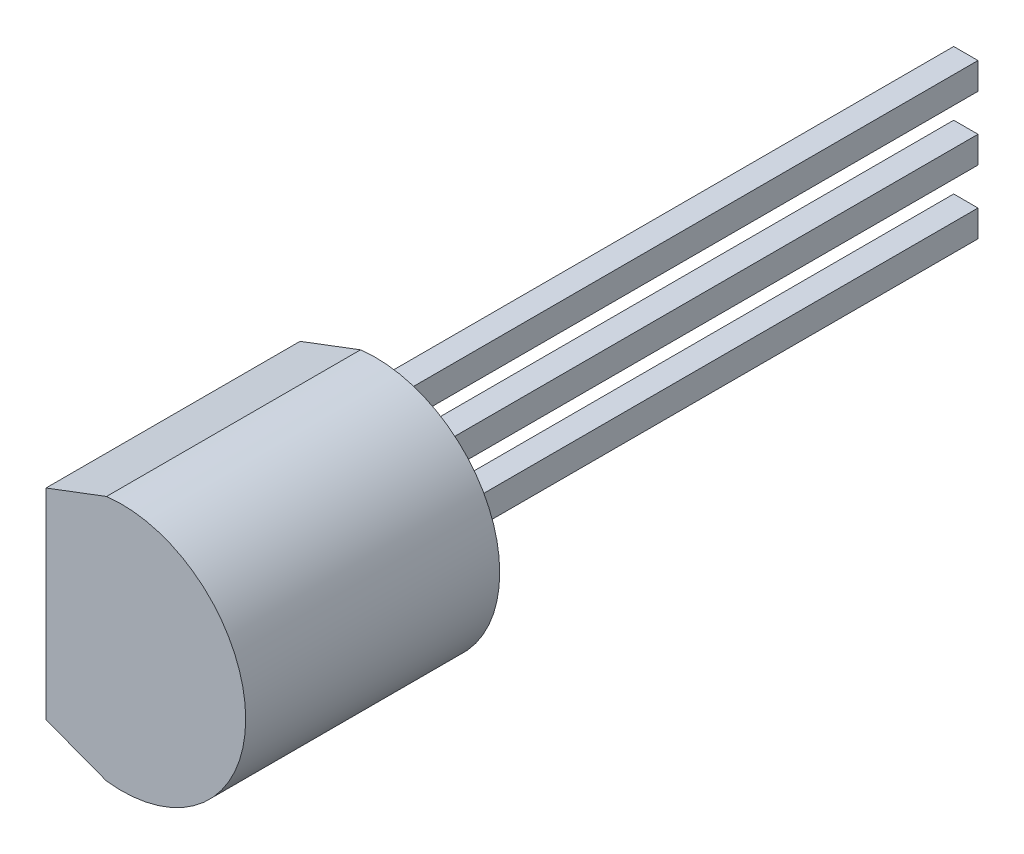
ISO-10303-21;
HEADER;
FILE_DESCRIPTION(('STEP AP214'),'2;1');
FILE_NAME('part.step','',(''),(''),'','','');
FILE_SCHEMA(('AUTOMOTIVE_DESIGN { 1 0 10303 214 1 1 1 1 }'));
ENDSEC;
DATA;
#1=APPLICATION_CONTEXT('core data for automotive mechanical design processes');
#2=APPLICATION_PROTOCOL_DEFINITION('international standard','automotive_design',2000,#1);
#3=PRODUCT_CONTEXT('',#1,'mechanical');
#4=PRODUCT('Part','Part','',(#3));
#5=PRODUCT_RELATED_PRODUCT_CATEGORY('part','',(#4));
#6=PRODUCT_DEFINITION_FORMATION('','',#4);
#7=PRODUCT_DEFINITION_CONTEXT('part definition',#1,'design');
#8=PRODUCT_DEFINITION('design','',#6,#7);
#9=PRODUCT_DEFINITION_SHAPE('','',#8);
#10=(LENGTH_UNIT() NAMED_UNIT(*) SI_UNIT(.MILLI.,.METRE.));
#11=(NAMED_UNIT(*) PLANE_ANGLE_UNIT() SI_UNIT($,.RADIAN.));
#12=(NAMED_UNIT(*) SI_UNIT($,.STERADIAN.) SOLID_ANGLE_UNIT());
#13=UNCERTAINTY_MEASURE_WITH_UNIT(LENGTH_MEASURE(1.E-05),#10,'distance_accuracy_value','');
#14=(GEOMETRIC_REPRESENTATION_CONTEXT(3) GLOBAL_UNCERTAINTY_ASSIGNED_CONTEXT((#13)) GLOBAL_UNIT_ASSIGNED_CONTEXT((#10,
#11,#12)) REPRESENTATION_CONTEXT('',''));
#15=CARTESIAN_POINT('',(0.,0.,0.));
#16=DIRECTION('',(0.,0.,1.));
#17=DIRECTION('',(1.,0.,0.));
#18=AXIS2_PLACEMENT_3D('',#15,#16,#17);
#19=CARTESIAN_POINT('',(0.314999999999993,0.,0.));
#20=DIRECTION('',(0.,0.,-1.));
#21=DIRECTION('',(-1.,0.,0.));
#22=AXIS2_PLACEMENT_3D('',#19,#20,#21);
#23=PLANE('',#22);
#24=DIRECTION('',(-1.,0.,0.));
#25=VECTOR('',#24,1.);
#26=CARTESIAN_POINT('',(-0.255,-0.28,0.));
#27=LINE('',#26,#25);
#28=CARTESIAN_POINT('',(0.255,-0.28,0.));
#29=VERTEX_POINT('',#28);
#30=CARTESIAN_POINT('',(-0.255,-0.28,0.));
#31=VERTEX_POINT('',#30);
#32=EDGE_CURVE('E175',#29,#31,#27,.T.);
#33=ORIENTED_EDGE('',*,*,#32,.F.);
#34=DIRECTION('',(0.,-1.,0.));
#35=VECTOR('',#34,1.);
#36=CARTESIAN_POINT('',(0.255,0.28,0.));
#37=LINE('',#36,#35);
#38=CARTESIAN_POINT('',(0.255,0.28,0.));
#39=VERTEX_POINT('',#38);
#40=EDGE_CURVE('E172',#39,#29,#37,.T.);
#41=ORIENTED_EDGE('',*,*,#40,.F.);
#42=DIRECTION('',(1.,0.,0.));
#43=VECTOR('',#42,1.);
#44=CARTESIAN_POINT('',(-0.255,0.28,0.));
#45=LINE('',#44,#43);
#46=CARTESIAN_POINT('',(-0.255,0.28,0.));
#47=VERTEX_POINT('',#46);
#48=EDGE_CURVE('E184',#47,#39,#45,.T.);
#49=ORIENTED_EDGE('',*,*,#48,.F.);
#50=DIRECTION('',(0.,1.,0.));
#51=VECTOR('',#50,1.);
#52=CARTESIAN_POINT('',(-0.255,0.28,0.));
#53=LINE('',#52,#51);
#54=EDGE_CURVE('E192',#31,#47,#53,.T.);
#55=ORIENTED_EDGE('',*,*,#54,.F.);
#56=EDGE_LOOP('',(#33,#41,#49,#55));
#57=FACE_BOUND('',#56,.T.);
#58=DIRECTION('',(-0.935202332585554,-0.354113819451513,0.));
#59=VECTOR('',#58,1.);
#60=CARTESIAN_POINT('',(-1.27000000000001,2.105,0.));
#61=LINE('',#60,#59);
#62=CARTESIAN_POINT('',(0.,2.58588476154681,0.));
#63=VERTEX_POINT('',#62);
#64=CARTESIAN_POINT('',(-1.27000000000001,2.105,0.));
#65=VERTEX_POINT('',#64);
#66=EDGE_CURVE('E232',#63,#65,#61,.T.);
#67=ORIENTED_EDGE('',*,*,#66,.F.);
#68=CARTESIAN_POINT('',(0.314999999999993,0.,0.));
#69=DIRECTION('',(0.,0.,1.));
#70=DIRECTION('',(-1.,0.,0.));
#71=AXIS2_PLACEMENT_3D('',#68,#69,#70);
#72=CIRCLE('',#71,2.605);
#73=CARTESIAN_POINT('',(0.,-2.58588476154681,0.));
#74=VERTEX_POINT('',#73);
#75=EDGE_CURVE('E237',#74,#63,#72,.T.);
#76=ORIENTED_EDGE('',*,*,#75,.F.);
#77=DIRECTION('',(0.935202332585554,-0.354113819451513,0.));
#78=VECTOR('',#77,1.);
#79=CARTESIAN_POINT('',(0.,-2.58588476154681,0.));
#80=LINE('',#79,#78);
#81=CARTESIAN_POINT('',(-1.27000000000001,-2.105,0.));
#82=VERTEX_POINT('',#81);
#83=EDGE_CURVE('E248',#82,#74,#80,.T.);
#84=ORIENTED_EDGE('',*,*,#83,.F.);
#85=DIRECTION('',(0.,-1.,0.));
#86=VECTOR('',#85,1.);
#87=CARTESIAN_POINT('',(-1.27000000000001,2.105,0.));
#88=LINE('',#87,#86);
#89=EDGE_CURVE('E246',#65,#82,#88,.T.);
#90=ORIENTED_EDGE('',*,*,#89,.F.);
#91=EDGE_LOOP('',(#67,#76,#84,#90));
#92=FACE_BOUND('',#91,.T.);
#93=DIRECTION('',(-1.,0.,0.));
#94=VECTOR('',#93,1.);
#95=CARTESIAN_POINT('',(-0.255,1.06,0.));
#96=LINE('',#95,#94);
#97=CARTESIAN_POINT('',(0.255,1.06,0.));
#98=VERTEX_POINT('',#97);
#99=CARTESIAN_POINT('',(-0.255,1.06,0.));
#100=VERTEX_POINT('',#99);
#101=EDGE_CURVE('E217',#98,#100,#96,.T.);
#102=ORIENTED_EDGE('',*,*,#101,.F.);
#103=DIRECTION('',(0.,-1.,0.));
#104=VECTOR('',#103,1.);
#105=CARTESIAN_POINT('',(0.255,1.62,0.));
#106=LINE('',#105,#104);
#107=CARTESIAN_POINT('',(0.255,1.62,0.));
#108=VERTEX_POINT('',#107);
#109=EDGE_CURVE('E203',#108,#98,#106,.T.);
#110=ORIENTED_EDGE('',*,*,#109,.F.);
#111=DIRECTION('',(1.,0.,0.));
#112=VECTOR('',#111,1.);
#113=CARTESIAN_POINT('',(-0.255,1.62,0.));
#114=LINE('',#113,#112);
#115=CARTESIAN_POINT('',(-0.254999999999999,1.62,0.));
#116=VERTEX_POINT('',#115);
#117=EDGE_CURVE('E208',#116,#108,#114,.T.);
#118=ORIENTED_EDGE('',*,*,#117,.F.);
#119=DIRECTION('',(0.,1.,0.));
#120=VECTOR('',#119,1.);
#121=CARTESIAN_POINT('',(-0.255,1.62,0.));
#122=LINE('',#121,#120);
#123=EDGE_CURVE('E219',#100,#116,#122,.T.);
#124=ORIENTED_EDGE('',*,*,#123,.F.);
#125=EDGE_LOOP('',(#102,#110,#118,#124));
#126=FACE_BOUND('',#125,.T.);
#127=DIRECTION('',(-1.,0.,0.));
#128=VECTOR('',#127,1.);
#129=CARTESIAN_POINT('',(-0.255,-1.62,0.));
#130=LINE('',#129,#128);
#131=CARTESIAN_POINT('',(0.255,-1.62,0.));
#132=VERTEX_POINT('',#131);
#133=CARTESIAN_POINT('',(-0.255,-1.62,0.));
#134=VERTEX_POINT('',#133);
#135=EDGE_CURVE('E474',#132,#134,#130,.T.);
#136=ORIENTED_EDGE('',*,*,#135,.F.);
#137=DIRECTION('',(0.,-1.,0.));
#138=VECTOR('',#137,1.);
#139=CARTESIAN_POINT('',(0.255,-1.06,0.));
#140=LINE('',#139,#138);
#141=CARTESIAN_POINT('',(0.255,-1.06,0.));
#142=VERTEX_POINT('',#141);
#143=EDGE_CURVE('E170',#142,#132,#140,.T.);
#144=ORIENTED_EDGE('',*,*,#143,.F.);
#145=DIRECTION('',(1.,0.,0.));
#146=VECTOR('',#145,1.);
#147=CARTESIAN_POINT('',(-0.255,-1.06,0.));
#148=LINE('',#147,#146);
#149=CARTESIAN_POINT('',(-0.255,-1.06,0.));
#150=VERTEX_POINT('',#149);
#151=EDGE_CURVE('E166',#150,#142,#148,.T.);
#152=ORIENTED_EDGE('',*,*,#151,.F.);
#153=DIRECTION('',(0.,1.,0.));
#154=VECTOR('',#153,1.);
#155=CARTESIAN_POINT('',(-0.255,-1.06,0.));
#156=LINE('',#155,#154);
#157=EDGE_CURVE('E471',#134,#150,#156,.T.);
#158=ORIENTED_EDGE('',*,*,#157,.F.);
#159=EDGE_LOOP('',(#136,#144,#152,#158));
#160=FACE_BOUND('',#159,.T.);
#161=ADVANCED_FACE('F33',(#57,#92,#126,#160),#23,.T.);
#162=CARTESIAN_POINT('',(-1.27000000000001,2.105,5.33));
#163=DIRECTION('',(0.354113819451513,-0.935202332585554,0.));
#164=DIRECTION('',(0.935202332585554,0.354113819451513,0.));
#165=AXIS2_PLACEMENT_3D('',#162,#163,#164);
#166=PLANE('',#165);
#167=ORIENTED_EDGE('',*,*,#66,.T.);
#168=DIRECTION('',(0.,0.,-1.));
#169=VECTOR('',#168,1.);
#170=CARTESIAN_POINT('',(-1.27000000000001,2.105,5.33));
#171=LINE('',#170,#169);
#172=CARTESIAN_POINT('',(-1.27000000000001,2.105,5.33));
#173=VERTEX_POINT('',#172);
#174=EDGE_CURVE('E11',#173,#65,#171,.T.);
#175=ORIENTED_EDGE('',*,*,#174,.F.);
#176=DIRECTION('',(-0.935202332585554,-0.354113819451513,0.));
#177=VECTOR('',#176,1.);
#178=CARTESIAN_POINT('',(-1.27000000000001,2.105,5.33));
#179=LINE('',#178,#177);
#180=CARTESIAN_POINT('',(0.,2.58588476154681,5.33));
#181=VERTEX_POINT('',#180);
#182=EDGE_CURVE('E233',#181,#173,#179,.T.);
#183=ORIENTED_EDGE('',*,*,#182,.F.);
#184=DIRECTION('',(0.,0.,-1.));
#185=VECTOR('',#184,1.);
#186=CARTESIAN_POINT('',(0.,2.58588476154681,5.33));
#187=LINE('',#186,#185);
#188=EDGE_CURVE('E243',#181,#63,#187,.T.);
#189=ORIENTED_EDGE('',*,*,#188,.T.);
#190=EDGE_LOOP('',(#167,#175,#183,#189));
#191=FACE_BOUND('',#190,.T.);
#192=ADVANCED_FACE('F35',(#191),#166,.F.);
#193=CARTESIAN_POINT('',(-1.27000000000001,2.105,5.33));
#194=DIRECTION('',(1.,0.,0.));
#195=DIRECTION('',(0.,0.,-1.));
#196=AXIS2_PLACEMENT_3D('',#193,#194,#195);
#197=PLANE('',#196);
#198=ORIENTED_EDGE('',*,*,#89,.T.);
#199=DIRECTION('',(0.,0.,-1.));
#200=VECTOR('',#199,1.);
#201=CARTESIAN_POINT('',(-1.27000000000001,-2.105,5.33));
#202=LINE('',#201,#200);
#203=CARTESIAN_POINT('',(-1.27000000000001,-2.105,5.33));
#204=VERTEX_POINT('',#203);
#205=EDGE_CURVE('E41',#204,#82,#202,.T.);
#206=ORIENTED_EDGE('',*,*,#205,.F.);
#207=DIRECTION('',(0.,-1.,0.));
#208=VECTOR('',#207,1.);
#209=CARTESIAN_POINT('',(-1.27000000000001,2.105,5.33));
#210=LINE('',#209,#208);
#211=EDGE_CURVE('E236',#173,#204,#210,.T.);
#212=ORIENTED_EDGE('',*,*,#211,.F.);
#213=ORIENTED_EDGE('',*,*,#174,.T.);
#214=EDGE_LOOP('',(#198,#206,#212,#213));
#215=FACE_BOUND('',#214,.T.);
#216=ADVANCED_FACE('F276',(#215),#197,.F.);
#217=CARTESIAN_POINT('',(0.,-2.58588476154681,5.33));
#218=DIRECTION('',(0.354113819451513,0.935202332585554,0.));
#219=DIRECTION('',(-0.935202332585554,0.354113819451513,0.));
#220=AXIS2_PLACEMENT_3D('',#217,#218,#219);
#221=PLANE('',#220);
#222=ORIENTED_EDGE('',*,*,#83,.T.);
#223=DIRECTION('',(0.,0.,-1.));
#224=VECTOR('',#223,1.);
#225=CARTESIAN_POINT('',(0.,-2.58588476154681,5.33));
#226=LINE('',#225,#224);
#227=CARTESIAN_POINT('',(0.,-2.58588476154681,5.33));
#228=VERTEX_POINT('',#227);
#229=EDGE_CURVE('E253',#228,#74,#226,.T.);
#230=ORIENTED_EDGE('',*,*,#229,.F.);
#231=DIRECTION('',(0.935202332585554,-0.354113819451513,0.));
#232=VECTOR('',#231,1.);
#233=CARTESIAN_POINT('',(0.,-2.58588476154681,5.33));
#234=LINE('',#233,#232);
#235=EDGE_CURVE('E239',#204,#228,#234,.T.);
#236=ORIENTED_EDGE('',*,*,#235,.F.);
#237=ORIENTED_EDGE('',*,*,#205,.T.);
#238=EDGE_LOOP('',(#222,#230,#236,#237));
#239=FACE_BOUND('',#238,.T.);
#240=ADVANCED_FACE('F260',(#239),#221,.F.);
#241=CARTESIAN_POINT('',(0.314999999999993,0.,5.33));
#242=DIRECTION('',(0.,0.,-1.));
#243=DIRECTION('',(-1.,0.,0.));
#244=AXIS2_PLACEMENT_3D('',#241,#242,#243);
#245=CYLINDRICAL_SURFACE('',#244,2.605);
#246=ORIENTED_EDGE('',*,*,#75,.T.);
#247=ORIENTED_EDGE('',*,*,#188,.F.);
#248=CARTESIAN_POINT('',(0.314999999999993,0.,5.33));
#249=DIRECTION('',(0.,0.,1.));
#250=DIRECTION('',(-1.,0.,0.));
#251=AXIS2_PLACEMENT_3D('',#248,#249,#250);
#252=CIRCLE('',#251,2.605);
#253=EDGE_CURVE('E241',#228,#181,#252,.T.);
#254=ORIENTED_EDGE('',*,*,#253,.F.);
#255=ORIENTED_EDGE('',*,*,#229,.T.);
#256=EDGE_LOOP('',(#246,#247,#254,#255));
#257=FACE_BOUND('',#256,.T.);
#258=ADVANCED_FACE('F269',(#257),#245,.T.);
#259=CARTESIAN_POINT('',(0.314999999999993,0.,5.33));
#260=DIRECTION('',(0.,0.,-1.));
#261=DIRECTION('',(-1.,0.,0.));
#262=AXIS2_PLACEMENT_3D('',#259,#260,#261);
#263=PLANE('',#262);
#264=ORIENTED_EDGE('',*,*,#182,.T.);
#265=ORIENTED_EDGE('',*,*,#211,.T.);
#266=ORIENTED_EDGE('',*,*,#235,.T.);
#267=ORIENTED_EDGE('',*,*,#253,.T.);
#268=EDGE_LOOP('',(#264,#265,#266,#267));
#269=FACE_BOUND('',#268,.T.);
#270=ADVANCED_FACE('F275',(#269),#263,.F.);
#271=CARTESIAN_POINT('',(0.255,1.62,-12.7));
#272=DIRECTION('',(-1.,0.,0.));
#273=DIRECTION('',(0.,-1.,0.));
#274=AXIS2_PLACEMENT_3D('',#271,#272,#273);
#275=PLANE('',#274);
#276=ORIENTED_EDGE('',*,*,#109,.T.);
#277=DIRECTION('',(0.,0.,1.));
#278=VECTOR('',#277,1.);
#279=CARTESIAN_POINT('',(0.255,1.06,-12.7));
#280=LINE('',#279,#278);
#281=CARTESIAN_POINT('',(0.255,1.06,-12.7));
#282=VERTEX_POINT('',#281);
#283=EDGE_CURVE('E230',#282,#98,#280,.T.);
#284=ORIENTED_EDGE('',*,*,#283,.F.);
#285=DIRECTION('',(0.,-1.,0.));
#286=VECTOR('',#285,1.);
#287=CARTESIAN_POINT('',(0.255,1.62,-12.7));
#288=LINE('',#287,#286);
#289=CARTESIAN_POINT('',(0.255,1.62,-12.7));
#290=VERTEX_POINT('',#289);
#291=EDGE_CURVE('E204',#290,#282,#288,.T.);
#292=ORIENTED_EDGE('',*,*,#291,.F.);
#293=DIRECTION('',(0.,0.,1.));
#294=VECTOR('',#293,1.);
#295=CARTESIAN_POINT('',(0.255,1.62,-12.7));
#296=LINE('',#295,#294);
#297=EDGE_CURVE('E214',#290,#108,#296,.T.);
#298=ORIENTED_EDGE('',*,*,#297,.T.);
#299=EDGE_LOOP('',(#276,#284,#292,#298));
#300=FACE_BOUND('',#299,.T.);
#301=ADVANCED_FACE('F296',(#300),#275,.F.);
#302=CARTESIAN_POINT('',(-0.255,1.06,-12.7));
#303=DIRECTION('',(0.,1.,0.));
#304=DIRECTION('',(0.,0.,1.));
#305=AXIS2_PLACEMENT_3D('',#302,#303,#304);
#306=PLANE('',#305);
#307=ORIENTED_EDGE('',*,*,#101,.T.);
#308=DIRECTION('',(0.,0.,1.));
#309=VECTOR('',#308,1.);
#310=CARTESIAN_POINT('',(-0.255,1.06,-12.7));
#311=LINE('',#310,#309);
#312=CARTESIAN_POINT('',(-0.255,1.06,-12.7));
#313=VERTEX_POINT('',#312);
#314=EDGE_CURVE('E227',#313,#100,#311,.T.);
#315=ORIENTED_EDGE('',*,*,#314,.F.);
#316=DIRECTION('',(-1.,0.,0.));
#317=VECTOR('',#316,1.);
#318=CARTESIAN_POINT('',(-0.255,1.06,-12.7));
#319=LINE('',#318,#317);
#320=EDGE_CURVE('E207',#282,#313,#319,.T.);
#321=ORIENTED_EDGE('',*,*,#320,.F.);
#322=ORIENTED_EDGE('',*,*,#283,.T.);
#323=EDGE_LOOP('',(#307,#315,#321,#322));
#324=FACE_BOUND('',#323,.T.);
#325=ADVANCED_FACE('F300',(#324),#306,.F.);
#326=CARTESIAN_POINT('',(-0.255,1.62,-12.7));
#327=DIRECTION('',(1.,0.,0.));
#328=DIRECTION('',(0.,1.,0.));
#329=AXIS2_PLACEMENT_3D('',#326,#327,#328);
#330=PLANE('',#329);
#331=ORIENTED_EDGE('',*,*,#123,.T.);
#332=DIRECTION('',(0.,0.,1.));
#333=VECTOR('',#332,1.);
#334=CARTESIAN_POINT('',(-0.255,1.62,-12.7));
#335=LINE('',#334,#333);
#336=CARTESIAN_POINT('',(-0.255,1.62,-12.7));
#337=VERTEX_POINT('',#336);
#338=EDGE_CURVE('E225',#337,#116,#335,.T.);
#339=ORIENTED_EDGE('',*,*,#338,.F.);
#340=DIRECTION('',(0.,1.,0.));
#341=VECTOR('',#340,1.);
#342=CARTESIAN_POINT('',(-0.255,1.62,-12.7));
#343=LINE('',#342,#341);
#344=EDGE_CURVE('E210',#313,#337,#343,.T.);
#345=ORIENTED_EDGE('',*,*,#344,.F.);
#346=ORIENTED_EDGE('',*,*,#314,.T.);
#347=EDGE_LOOP('',(#331,#339,#345,#346));
#348=FACE_BOUND('',#347,.T.);
#349=ADVANCED_FACE('F305',(#348),#330,.F.);
#350=CARTESIAN_POINT('',(-0.255,1.62,-12.7));
#351=DIRECTION('',(0.,-1.,0.));
#352=DIRECTION('',(0.,0.,-1.));
#353=AXIS2_PLACEMENT_3D('',#350,#351,#352);
#354=PLANE('',#353);
#355=ORIENTED_EDGE('',*,*,#117,.T.);
#356=ORIENTED_EDGE('',*,*,#297,.F.);
#357=DIRECTION('',(1.,0.,0.));
#358=VECTOR('',#357,1.);
#359=CARTESIAN_POINT('',(-0.255,1.62,-12.7));
#360=LINE('',#359,#358);
#361=EDGE_CURVE('E212',#337,#290,#360,.T.);
#362=ORIENTED_EDGE('',*,*,#361,.F.);
#363=ORIENTED_EDGE('',*,*,#338,.T.);
#364=EDGE_LOOP('',(#355,#356,#362,#363));
#365=FACE_BOUND('',#364,.T.);
#366=ADVANCED_FACE('F311',(#365),#354,.F.);
#367=CARTESIAN_POINT('',(0.,0.,-12.7));
#368=DIRECTION('',(0.,0.,1.));
#369=DIRECTION('',(1.,0.,0.));
#370=AXIS2_PLACEMENT_3D('',#367,#368,#369);
#371=PLANE('',#370);
#372=ORIENTED_EDGE('',*,*,#291,.T.);
#373=ORIENTED_EDGE('',*,*,#320,.T.);
#374=ORIENTED_EDGE('',*,*,#344,.T.);
#375=ORIENTED_EDGE('',*,*,#361,.T.);
#376=EDGE_LOOP('',(#372,#373,#374,#375));
#377=FACE_BOUND('',#376,.T.);
#378=ADVANCED_FACE('F315',(#377),#371,.F.);
#379=CARTESIAN_POINT('',(0.255,0.28,-12.7));
#380=DIRECTION('',(-1.,0.,0.));
#381=DIRECTION('',(0.,-1.,0.));
#382=AXIS2_PLACEMENT_3D('',#379,#380,#381);
#383=PLANE('',#382);
#384=ORIENTED_EDGE('',*,*,#40,.T.);
#385=DIRECTION('',(0.,0.,1.));
#386=VECTOR('',#385,1.);
#387=CARTESIAN_POINT('',(0.255,-0.28,-12.7));
#388=LINE('',#387,#386);
#389=CARTESIAN_POINT('',(0.255,-0.28,-12.7));
#390=VERTEX_POINT('',#389);
#391=EDGE_CURVE('E201',#390,#29,#388,.T.);
#392=ORIENTED_EDGE('',*,*,#391,.F.);
#393=DIRECTION('',(0.,-1.,0.));
#394=VECTOR('',#393,1.);
#395=CARTESIAN_POINT('',(0.255,0.28,-12.7));
#396=LINE('',#395,#394);
#397=CARTESIAN_POINT('',(0.255,0.28,-12.7));
#398=VERTEX_POINT('',#397);
#399=EDGE_CURVE('E180',#398,#390,#396,.T.);
#400=ORIENTED_EDGE('',*,*,#399,.F.);
#401=DIRECTION('',(0.,0.,1.));
#402=VECTOR('',#401,1.);
#403=CARTESIAN_POINT('',(0.255,0.28,-12.7));
#404=LINE('',#403,#402);
#405=EDGE_CURVE('E189',#398,#39,#404,.T.);
#406=ORIENTED_EDGE('',*,*,#405,.T.);
#407=EDGE_LOOP('',(#384,#392,#400,#406));
#408=FACE_BOUND('',#407,.T.);
#409=ADVANCED_FACE('F319',(#408),#383,.F.);
#410=CARTESIAN_POINT('',(-0.255,-0.28,-12.7));
#411=DIRECTION('',(0.,1.,0.));
#412=DIRECTION('',(-1.,0.,0.));
#413=AXIS2_PLACEMENT_3D('',#410,#411,#412);
#414=PLANE('',#413);
#415=ORIENTED_EDGE('',*,*,#32,.T.);
#416=DIRECTION('',(0.,0.,1.));
#417=VECTOR('',#416,1.);
#418=CARTESIAN_POINT('',(-0.255,-0.28,-12.7));
#419=LINE('',#418,#417);
#420=CARTESIAN_POINT('',(-0.255,-0.28,-12.7));
#421=VERTEX_POINT('',#420);
#422=EDGE_CURVE('E198',#421,#31,#419,.T.);
#423=ORIENTED_EDGE('',*,*,#422,.F.);
#424=DIRECTION('',(-1.,0.,0.));
#425=VECTOR('',#424,1.);
#426=CARTESIAN_POINT('',(-0.255,-0.28,-12.7));
#427=LINE('',#426,#425);
#428=EDGE_CURVE('E183',#390,#421,#427,.T.);
#429=ORIENTED_EDGE('',*,*,#428,.F.);
#430=ORIENTED_EDGE('',*,*,#391,.T.);
#431=EDGE_LOOP('',(#415,#423,#429,#430));
#432=FACE_BOUND('',#431,.T.);
#433=ADVANCED_FACE('F323',(#432),#414,.F.);
#434=CARTESIAN_POINT('',(-0.255,0.28,-12.7));
#435=DIRECTION('',(1.,0.,0.));
#436=DIRECTION('',(0.,1.,0.));
#437=AXIS2_PLACEMENT_3D('',#434,#435,#436);
#438=PLANE('',#437);
#439=ORIENTED_EDGE('',*,*,#54,.T.);
#440=DIRECTION('',(0.,0.,1.));
#441=VECTOR('',#440,1.);
#442=CARTESIAN_POINT('',(-0.255,0.28,-12.7));
#443=LINE('',#442,#441);
#444=CARTESIAN_POINT('',(-0.255,0.28,-12.7));
#445=VERTEX_POINT('',#444);
#446=EDGE_CURVE('E56',#445,#47,#443,.T.);
#447=ORIENTED_EDGE('',*,*,#446,.F.);
#448=DIRECTION('',(0.,1.,0.));
#449=VECTOR('',#448,1.);
#450=CARTESIAN_POINT('',(-0.255,0.28,-12.7));
#451=LINE('',#450,#449);
#452=EDGE_CURVE('E186',#421,#445,#451,.T.);
#453=ORIENTED_EDGE('',*,*,#452,.F.);
#454=ORIENTED_EDGE('',*,*,#422,.T.);
#455=EDGE_LOOP('',(#439,#447,#453,#454));
#456=FACE_BOUND('',#455,.T.);
#457=ADVANCED_FACE('F327',(#456),#438,.F.);
#458=CARTESIAN_POINT('',(-0.255,0.28,-12.7));
#459=DIRECTION('',(0.,-1.,0.));
#460=DIRECTION('',(1.,0.,0.));
#461=AXIS2_PLACEMENT_3D('',#458,#459,#460);
#462=PLANE('',#461);
#463=ORIENTED_EDGE('',*,*,#48,.T.);
#464=ORIENTED_EDGE('',*,*,#405,.F.);
#465=DIRECTION('',(1.,0.,0.));
#466=VECTOR('',#465,1.);
#467=CARTESIAN_POINT('',(-0.255,0.28,-12.7));
#468=LINE('',#467,#466);
#469=EDGE_CURVE('E188',#445,#398,#468,.T.);
#470=ORIENTED_EDGE('',*,*,#469,.F.);
#471=ORIENTED_EDGE('',*,*,#446,.T.);
#472=EDGE_LOOP('',(#463,#464,#470,#471));
#473=FACE_BOUND('',#472,.T.);
#474=ADVANCED_FACE('F331',(#473),#462,.F.);
#475=CARTESIAN_POINT('',(0.,0.,-12.7));
#476=DIRECTION('',(0.,0.,1.));
#477=DIRECTION('',(1.,0.,0.));
#478=AXIS2_PLACEMENT_3D('',#475,#476,#477);
#479=PLANE('',#478);
#480=ORIENTED_EDGE('',*,*,#399,.T.);
#481=ORIENTED_EDGE('',*,*,#428,.T.);
#482=ORIENTED_EDGE('',*,*,#452,.T.);
#483=ORIENTED_EDGE('',*,*,#469,.T.);
#484=EDGE_LOOP('',(#480,#481,#482,#483));
#485=FACE_BOUND('',#484,.T.);
#486=ADVANCED_FACE('F335',(#485),#479,.F.);
#487=CARTESIAN_POINT('',(0.255,-1.06,-12.7));
#488=DIRECTION('',(-1.,0.,0.));
#489=DIRECTION('',(0.,-1.,0.));
#490=AXIS2_PLACEMENT_3D('',#487,#488,#489);
#491=PLANE('',#490);
#492=ORIENTED_EDGE('',*,*,#143,.T.);
#493=DIRECTION('',(0.,0.,1.));
#494=VECTOR('',#493,1.);
#495=CARTESIAN_POINT('',(0.255,-1.62,-12.7));
#496=LINE('',#495,#494);
#497=CARTESIAN_POINT('',(0.255,-1.62,-12.7));
#498=VERTEX_POINT('',#497);
#499=EDGE_CURVE('E151',#498,#132,#496,.T.);
#500=ORIENTED_EDGE('',*,*,#499,.F.);
#501=DIRECTION('',(0.,-1.,0.));
#502=VECTOR('',#501,1.);
#503=CARTESIAN_POINT('',(0.255,-1.06,-12.7));
#504=LINE('',#503,#502);
#505=CARTESIAN_POINT('',(0.255,-1.06,-12.7));
#506=VERTEX_POINT('',#505);
#507=EDGE_CURVE('E158',#506,#498,#504,.T.);
#508=ORIENTED_EDGE('',*,*,#507,.F.);
#509=DIRECTION('',(0.,0.,1.));
#510=VECTOR('',#509,1.);
#511=CARTESIAN_POINT('',(0.255,-1.06,-12.7));
#512=LINE('',#511,#510);
#513=EDGE_CURVE('E468',#506,#142,#512,.T.);
#514=ORIENTED_EDGE('',*,*,#513,.T.);
#515=EDGE_LOOP('',(#492,#500,#508,#514));
#516=FACE_BOUND('',#515,.T.);
#517=ADVANCED_FACE('F168',(#516),#491,.F.);
#518=CARTESIAN_POINT('',(-0.255,-1.62,-12.7));
#519=DIRECTION('',(0.,1.,0.));
#520=DIRECTION('',(0.,0.,1.));
#521=AXIS2_PLACEMENT_3D('',#518,#519,#520);
#522=PLANE('',#521);
#523=ORIENTED_EDGE('',*,*,#135,.T.);
#524=DIRECTION('',(0.,0.,1.));
#525=VECTOR('',#524,1.);
#526=CARTESIAN_POINT('',(-0.255,-1.62,-12.7));
#527=LINE('',#526,#525);
#528=CARTESIAN_POINT('',(-0.255,-1.62,-12.7));
#529=VERTEX_POINT('',#528);
#530=EDGE_CURVE('E154',#529,#134,#527,.T.);
#531=ORIENTED_EDGE('',*,*,#530,.F.);
#532=DIRECTION('',(-1.,0.,0.));
#533=VECTOR('',#532,1.);
#534=CARTESIAN_POINT('',(-0.255,-1.62,-12.7));
#535=LINE('',#534,#533);
#536=EDGE_CURVE('E147',#498,#529,#535,.T.);
#537=ORIENTED_EDGE('',*,*,#536,.F.);
#538=ORIENTED_EDGE('',*,*,#499,.T.);
#539=EDGE_LOOP('',(#523,#531,#537,#538));
#540=FACE_BOUND('',#539,.T.);
#541=ADVANCED_FACE('F149',(#540),#522,.F.);
#542=CARTESIAN_POINT('',(-0.255,-1.06,-12.7));
#543=DIRECTION('',(1.,0.,0.));
#544=DIRECTION('',(0.,1.,0.));
#545=AXIS2_PLACEMENT_3D('',#542,#543,#544);
#546=PLANE('',#545);
#547=ORIENTED_EDGE('',*,*,#157,.T.);
#548=DIRECTION('',(0.,0.,1.));
#549=VECTOR('',#548,1.);
#550=CARTESIAN_POINT('',(-0.255,-1.06,-12.7));
#551=LINE('',#550,#549);
#552=CARTESIAN_POINT('',(-0.255,-1.06,-12.7));
#553=VERTEX_POINT('',#552);
#554=EDGE_CURVE('E48',#553,#150,#551,.T.);
#555=ORIENTED_EDGE('',*,*,#554,.F.);
#556=DIRECTION('',(0.,1.,0.));
#557=VECTOR('',#556,1.);
#558=CARTESIAN_POINT('',(-0.255,-1.06,-12.7));
#559=LINE('',#558,#557);
#560=EDGE_CURVE('E157',#529,#553,#559,.T.);
#561=ORIENTED_EDGE('',*,*,#560,.F.);
#562=ORIENTED_EDGE('',*,*,#530,.T.);
#563=EDGE_LOOP('',(#547,#555,#561,#562));
#564=FACE_BOUND('',#563,.T.);
#565=ADVANCED_FACE('F343',(#564),#546,.F.);
#566=CARTESIAN_POINT('',(-0.255,-1.06,-12.7));
#567=DIRECTION('',(0.,-1.,0.));
#568=DIRECTION('',(0.,0.,-1.));
#569=AXIS2_PLACEMENT_3D('',#566,#567,#568);
#570=PLANE('',#569);
#571=ORIENTED_EDGE('',*,*,#151,.T.);
#572=ORIENTED_EDGE('',*,*,#513,.F.);
#573=DIRECTION('',(1.,0.,0.));
#574=VECTOR('',#573,1.);
#575=CARTESIAN_POINT('',(-0.255,-1.06,-12.7));
#576=LINE('',#575,#574);
#577=EDGE_CURVE('E162',#553,#506,#576,.T.);
#578=ORIENTED_EDGE('',*,*,#577,.F.);
#579=ORIENTED_EDGE('',*,*,#554,.T.);
#580=EDGE_LOOP('',(#571,#572,#578,#579));
#581=FACE_BOUND('',#580,.T.);
#582=ADVANCED_FACE('F346',(#581),#570,.F.);
#583=CARTESIAN_POINT('',(0.,0.,-12.7));
#584=DIRECTION('',(0.,0.,1.));
#585=DIRECTION('',(1.,0.,0.));
#586=AXIS2_PLACEMENT_3D('',#583,#584,#585);
#587=PLANE('',#586);
#588=ORIENTED_EDGE('',*,*,#507,.T.);
#589=ORIENTED_EDGE('',*,*,#536,.T.);
#590=ORIENTED_EDGE('',*,*,#560,.T.);
#591=ORIENTED_EDGE('',*,*,#577,.T.);
#592=EDGE_LOOP('',(#588,#589,#590,#591));
#593=FACE_BOUND('',#592,.T.);
#594=ADVANCED_FACE('F161',(#593),#587,.F.);
#595=CLOSED_SHELL('',(#161,#192,#216,#240,#258,#270,#301,#325,#349,#366,#378,#409,#433,#457,
#474,#486,#517,#541,#565,#582,#594));
#596=MANIFOLD_SOLID_BREP('B2',#595);
#597=ADVANCED_BREP_SHAPE_REPRESENTATION('',(#18,#596),#14);
#598=SHAPE_DEFINITION_REPRESENTATION(#9,#597);
ENDSEC;
END-ISO-10303-21;
